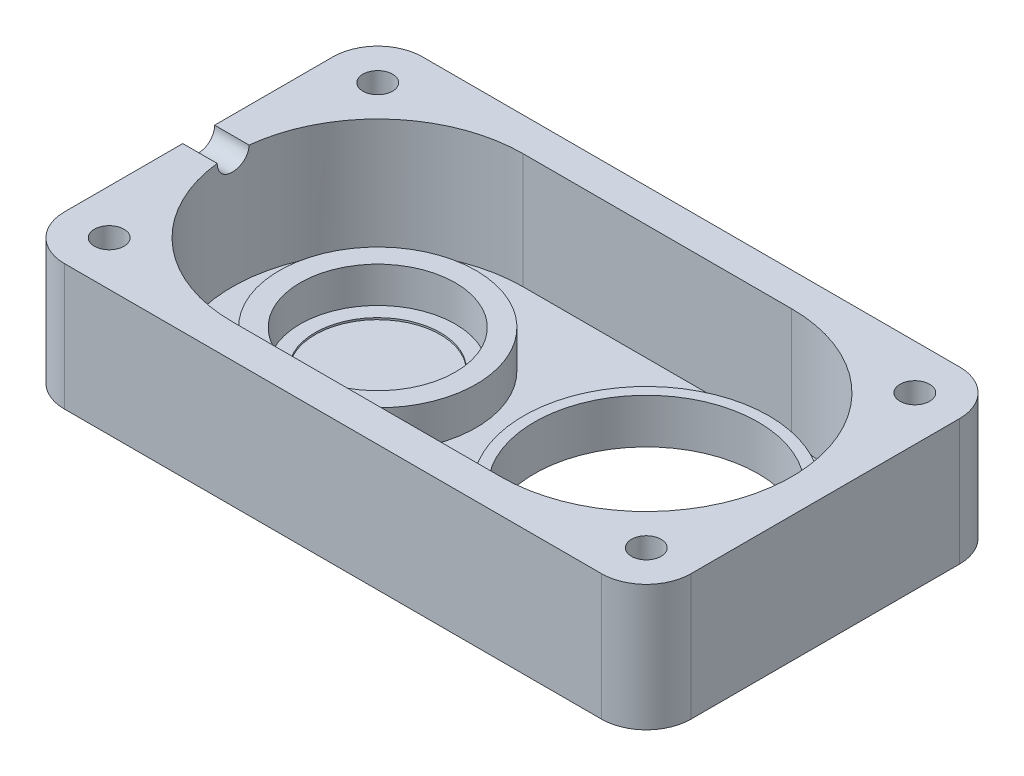
ISO-10303-21;
HEADER;
FILE_DESCRIPTION(('STEP AP214'),'2;1');
FILE_NAME('part.step','',(''),(''),'','','');
FILE_SCHEMA(('AUTOMOTIVE_DESIGN { 1 0 10303 214 1 1 1 1 }'));
ENDSEC;
DATA;
#1=APPLICATION_CONTEXT('core data for automotive mechanical design processes');
#2=APPLICATION_PROTOCOL_DEFINITION('international standard','automotive_design',2000,#1);
#3=PRODUCT_CONTEXT('',#1,'mechanical');
#4=PRODUCT('Part','Part','',(#3));
#5=PRODUCT_RELATED_PRODUCT_CATEGORY('part','',(#4));
#6=PRODUCT_DEFINITION_FORMATION('','',#4);
#7=PRODUCT_DEFINITION_CONTEXT('part definition',#1,'design');
#8=PRODUCT_DEFINITION('design','',#6,#7);
#9=PRODUCT_DEFINITION_SHAPE('','',#8);
#10=(LENGTH_UNIT() NAMED_UNIT(*) SI_UNIT(.MILLI.,.METRE.));
#11=(NAMED_UNIT(*) PLANE_ANGLE_UNIT() SI_UNIT($,.RADIAN.));
#12=(NAMED_UNIT(*) SI_UNIT($,.STERADIAN.) SOLID_ANGLE_UNIT());
#13=UNCERTAINTY_MEASURE_WITH_UNIT(LENGTH_MEASURE(1.E-05),#10,'distance_accuracy_value','');
#14=(GEOMETRIC_REPRESENTATION_CONTEXT(3) GLOBAL_UNCERTAINTY_ASSIGNED_CONTEXT((#13)) GLOBAL_UNIT_ASSIGNED_CONTEXT((#10,
#11,#12)) REPRESENTATION_CONTEXT('',''));
#15=CARTESIAN_POINT('',(0.,0.,0.));
#16=DIRECTION('',(0.,0.,1.));
#17=DIRECTION('',(1.,0.,0.));
#18=AXIS2_PLACEMENT_3D('',#15,#16,#17);
#19=CARTESIAN_POINT('',(-19.05,17.87906,-19.05));
#20=DIRECTION('',(0.,-1.,0.));
#21=DIRECTION('',(0.,0.,-1.));
#22=AXIS2_PLACEMENT_3D('',#19,#20,#21);
#23=CYLINDRICAL_SURFACE('',#22,2.1);
#24=CARTESIAN_POINT('',(-19.05,17.87906,-19.05));
#25=DIRECTION('',(0.,1.,0.));
#26=DIRECTION('',(0.,0.,1.));
#27=AXIS2_PLACEMENT_3D('',#24,#25,#26);
#28=CIRCLE('',#27,2.1);
#29=CARTESIAN_POINT('',(-19.05,17.87906,-16.95));
#30=VERTEX_POINT('',#29);
#31=EDGE_CURVE('E463',#30,#30,#28,.T.);
#32=ORIENTED_EDGE('',*,*,#31,.T.);
#33=EDGE_LOOP('',(#32));
#34=FACE_BOUND('',#33,.T.);
#35=CARTESIAN_POINT('',(-19.05,4.5,-19.05));
#36=DIRECTION('',(0.,-1.,0.));
#37=DIRECTION('',(0.,0.,-1.));
#38=AXIS2_PLACEMENT_3D('',#35,#36,#37);
#39=CIRCLE('',#38,2.1);
#40=CARTESIAN_POINT('',(-19.05,4.5,-21.15));
#41=VERTEX_POINT('',#40);
#42=EDGE_CURVE('E46',#41,#41,#39,.T.);
#43=ORIENTED_EDGE('',*,*,#42,.T.);
#44=EDGE_LOOP('',(#43));
#45=FACE_BOUND('',#44,.T.);
#46=ADVANCED_FACE('F42',(#34,#45),#23,.F.);
#47=CARTESIAN_POINT('',(-19.05,17.87906,19.05));
#48=DIRECTION('',(0.,-1.,0.));
#49=DIRECTION('',(0.,0.,-1.));
#50=AXIS2_PLACEMENT_3D('',#47,#48,#49);
#51=CYLINDRICAL_SURFACE('',#50,2.1);
#52=CARTESIAN_POINT('',(-19.05,17.87906,19.05));
#53=DIRECTION('',(0.,1.,0.));
#54=DIRECTION('',(0.,0.,1.));
#55=AXIS2_PLACEMENT_3D('',#52,#53,#54);
#56=CIRCLE('',#55,2.1);
#57=CARTESIAN_POINT('',(-19.05,17.87906,21.15));
#58=VERTEX_POINT('',#57);
#59=EDGE_CURVE('E459',#58,#58,#56,.T.);
#60=ORIENTED_EDGE('',*,*,#59,.T.);
#61=EDGE_LOOP('',(#60));
#62=FACE_BOUND('',#61,.T.);
#63=CARTESIAN_POINT('',(-19.05,4.5,19.05));
#64=DIRECTION('',(0.,-1.,0.));
#65=DIRECTION('',(0.,0.,-1.));
#66=AXIS2_PLACEMENT_3D('',#63,#64,#65);
#67=CIRCLE('',#66,2.1);
#68=CARTESIAN_POINT('',(-19.05,4.5,16.95));
#69=VERTEX_POINT('',#68);
#70=EDGE_CURVE('E264',#69,#69,#67,.T.);
#71=ORIENTED_EDGE('',*,*,#70,.T.);
#72=EDGE_LOOP('',(#71));
#73=FACE_BOUND('',#72,.T.);
#74=ADVANCED_FACE('F328',(#62,#73),#51,.F.);
#75=CARTESIAN_POINT('',(57.15,17.87906,19.05));
#76=DIRECTION('',(0.,-1.,0.));
#77=DIRECTION('',(0.,0.,-1.));
#78=AXIS2_PLACEMENT_3D('',#75,#76,#77);
#79=CYLINDRICAL_SURFACE('',#78,2.1);
#80=CARTESIAN_POINT('',(57.15,17.87906,19.05));
#81=DIRECTION('',(0.,1.,0.));
#82=DIRECTION('',(0.,0.,1.));
#83=AXIS2_PLACEMENT_3D('',#80,#81,#82);
#84=CIRCLE('',#83,2.1);
#85=CARTESIAN_POINT('',(57.15,17.87906,21.15));
#86=VERTEX_POINT('',#85);
#87=EDGE_CURVE('E455',#86,#86,#84,.T.);
#88=ORIENTED_EDGE('',*,*,#87,.T.);
#89=EDGE_LOOP('',(#88));
#90=FACE_BOUND('',#89,.T.);
#91=CARTESIAN_POINT('',(57.15,4.5,19.05));
#92=DIRECTION('',(0.,-1.,0.));
#93=DIRECTION('',(0.,0.,-1.));
#94=AXIS2_PLACEMENT_3D('',#91,#92,#93);
#95=CIRCLE('',#94,2.1);
#96=CARTESIAN_POINT('',(57.15,4.5,16.95));
#97=VERTEX_POINT('',#96);
#98=EDGE_CURVE('E260',#97,#97,#95,.T.);
#99=ORIENTED_EDGE('',*,*,#98,.T.);
#100=EDGE_LOOP('',(#99));
#101=FACE_BOUND('',#100,.T.);
#102=ADVANCED_FACE('F335',(#90,#101),#79,.F.);
#103=CARTESIAN_POINT('',(57.15,17.87906,-19.05));
#104=DIRECTION('',(0.,-1.,0.));
#105=DIRECTION('',(0.,0.,-1.));
#106=AXIS2_PLACEMENT_3D('',#103,#104,#105);
#107=CYLINDRICAL_SURFACE('',#106,2.1);
#108=CARTESIAN_POINT('',(57.15,17.87906,-19.05));
#109=DIRECTION('',(0.,1.,0.));
#110=DIRECTION('',(0.,0.,1.));
#111=AXIS2_PLACEMENT_3D('',#108,#109,#110);
#112=CIRCLE('',#111,2.1);
#113=CARTESIAN_POINT('',(57.15,17.87906,-16.95));
#114=VERTEX_POINT('',#113);
#115=EDGE_CURVE('E451',#114,#114,#112,.T.);
#116=ORIENTED_EDGE('',*,*,#115,.T.);
#117=EDGE_LOOP('',(#116));
#118=FACE_BOUND('',#117,.T.);
#119=CARTESIAN_POINT('',(57.15,4.5,-19.05));
#120=DIRECTION('',(0.,-1.,0.));
#121=DIRECTION('',(0.,0.,-1.));
#122=AXIS2_PLACEMENT_3D('',#119,#120,#121);
#123=CIRCLE('',#122,2.1);
#124=CARTESIAN_POINT('',(57.15,4.5,-21.15));
#125=VERTEX_POINT('',#124);
#126=EDGE_CURVE('E256',#125,#125,#123,.T.);
#127=ORIENTED_EDGE('',*,*,#126,.T.);
#128=EDGE_LOOP('',(#127));
#129=FACE_BOUND('',#128,.T.);
#130=ADVANCED_FACE('F512',(#118,#129),#107,.F.);
#131=CARTESIAN_POINT('',(-19.05,1.524,-19.05));
#132=DIRECTION('',(0.,-1.,0.));
#133=DIRECTION('',(0.,0.,-1.));
#134=AXIS2_PLACEMENT_3D('',#131,#132,#133);
#135=PLANE('',#134);
#136=CARTESIAN_POINT('',(0.,1.524,0.));
#137=DIRECTION('',(0.,-1.,0.));
#138=DIRECTION('',(0.,0.,-1.));
#139=AXIS2_PLACEMENT_3D('',#136,#137,#138);
#140=CIRCLE('',#139,20.6375);
#141=CARTESIAN_POINT('',(0.,1.524,-20.6375));
#142=VERTEX_POINT('',#141);
#143=CARTESIAN_POINT('',(0.,1.524,20.6375));
#144=VERTEX_POINT('',#143);
#145=EDGE_CURVE('E428',#142,#144,#140,.F.);
#146=ORIENTED_EDGE('',*,*,#145,.T.);
#147=DIRECTION('',(1.,0.,0.));
#148=VECTOR('',#147,1.);
#149=CARTESIAN_POINT('',(38.1,1.524,20.6375));
#150=LINE('',#149,#148);
#151=CARTESIAN_POINT('',(38.1,1.524,20.6375));
#152=VERTEX_POINT('',#151);
#153=EDGE_CURVE('E423',#144,#152,#150,.T.);
#154=ORIENTED_EDGE('',*,*,#153,.T.);
#155=CARTESIAN_POINT('',(38.1,1.524,0.));
#156=DIRECTION('',(0.,-1.,0.));
#157=DIRECTION('',(0.,0.,-1.));
#158=AXIS2_PLACEMENT_3D('',#155,#156,#157);
#159=CIRCLE('',#158,20.6375);
#160=CARTESIAN_POINT('',(38.1,1.524,-20.6375));
#161=VERTEX_POINT('',#160);
#162=EDGE_CURVE('E438',#152,#161,#159,.F.);
#163=ORIENTED_EDGE('',*,*,#162,.T.);
#164=DIRECTION('',(-1.,0.,0.));
#165=VECTOR('',#164,1.);
#166=CARTESIAN_POINT('',(0.,1.524,-20.6375));
#167=LINE('',#166,#165);
#168=EDGE_CURVE('E433',#161,#142,#167,.T.);
#169=ORIENTED_EDGE('',*,*,#168,.T.);
#170=EDGE_LOOP('',(#146,#154,#163,#169));
#171=FACE_BOUND('',#170,.T.);
#172=CARTESIAN_POINT('',(0.,1.524,0.));
#173=DIRECTION('',(0.,-1.,0.));
#174=DIRECTION('',(0.,0.,-1.));
#175=AXIS2_PLACEMENT_3D('',#172,#173,#174);
#176=CIRCLE('',#175,13.97);
#177=CARTESIAN_POINT('',(0.,1.524,-13.97));
#178=VERTEX_POINT('',#177);
#179=EDGE_CURVE('E52',#178,#178,#176,.F.);
#180=ORIENTED_EDGE('',*,*,#179,.F.);
#181=EDGE_LOOP('',(#180));
#182=FACE_BOUND('',#181,.T.);
#183=CARTESIAN_POINT('',(38.1,1.524,0.));
#184=DIRECTION('',(0.,-1.,0.));
#185=DIRECTION('',(0.,0.,-1.));
#186=AXIS2_PLACEMENT_3D('',#183,#184,#185);
#187=CIRCLE('',#186,17.399);
#188=CARTESIAN_POINT('',(38.1,1.524,-17.399));
#189=VERTEX_POINT('',#188);
#190=EDGE_CURVE('E12',#189,#189,#187,.F.);
#191=ORIENTED_EDGE('',*,*,#190,.F.);
#192=EDGE_LOOP('',(#191));
#193=FACE_BOUND('',#192,.T.);
#194=ADVANCED_FACE('F350',(#171,#182,#193),#135,.F.);
#195=CARTESIAN_POINT('',(-19.05,17.87906,-19.05));
#196=DIRECTION('',(0.,-1.,0.));
#197=DIRECTION('',(0.,0.,-1.));
#198=AXIS2_PLACEMENT_3D('',#195,#196,#197);
#199=PLANE('',#198);
#200=CARTESIAN_POINT('',(0.,17.87906,0.));
#201=DIRECTION('',(0.,1.,0.));
#202=DIRECTION('',(0.,0.,1.));
#203=AXIS2_PLACEMENT_3D('',#200,#201,#202);
#204=CIRCLE('',#203,20.6375);
#205=CARTESIAN_POINT('',(-20.5133150390179,17.87906,2.2606));
#206=VERTEX_POINT('',#205);
#207=CARTESIAN_POINT('',(0.,17.87906,20.6375));
#208=VERTEX_POINT('',#207);
#209=EDGE_CURVE('E162',#206,#208,#204,.T.);
#210=ORIENTED_EDGE('',*,*,#209,.F.);
#211=DIRECTION('',(-1.,0.,0.));
#212=VECTOR('',#211,1.);
#213=CARTESIAN_POINT('',(63.501,17.87906,2.2606));
#214=LINE('',#213,#212);
#215=CARTESIAN_POINT('',(-25.4,17.87906,2.2606));
#216=VERTEX_POINT('',#215);
#217=EDGE_CURVE('E60',#216,#206,#214,.F.);
#218=ORIENTED_EDGE('',*,*,#217,.F.);
#219=DIRECTION('',(0.,0.,1.));
#220=VECTOR('',#219,1.);
#221=CARTESIAN_POINT('',(-25.4,17.87906,19.05));
#222=LINE('',#221,#220);
#223=CARTESIAN_POINT('',(-25.4,17.87906,19.05));
#224=VERTEX_POINT('',#223);
#225=EDGE_CURVE('E159',#216,#224,#222,.T.);
#226=ORIENTED_EDGE('',*,*,#225,.T.);
#227=CARTESIAN_POINT('',(-19.05,17.87906,19.05));
#228=DIRECTION('',(0.,1.,0.));
#229=DIRECTION('',(0.,0.,-1.));
#230=AXIS2_PLACEMENT_3D('',#227,#228,#229);
#231=CIRCLE('',#230,6.35);
#232=CARTESIAN_POINT('',(-19.0499999999999,17.87906,25.4));
#233=VERTEX_POINT('',#232);
#234=EDGE_CURVE('E175',#224,#233,#231,.T.);
#235=ORIENTED_EDGE('',*,*,#234,.T.);
#236=DIRECTION('',(1.,0.,0.));
#237=VECTOR('',#236,1.);
#238=CARTESIAN_POINT('',(-19.0499999999999,17.87906,25.4));
#239=LINE('',#238,#237);
#240=CARTESIAN_POINT('',(57.15,17.87906,25.4));
#241=VERTEX_POINT('',#240);
#242=EDGE_CURVE('E183',#233,#241,#239,.T.);
#243=ORIENTED_EDGE('',*,*,#242,.T.);
#244=CARTESIAN_POINT('',(57.15,17.87906,19.05));
#245=DIRECTION('',(0.,1.,0.));
#246=DIRECTION('',(0.,0.,1.));
#247=AXIS2_PLACEMENT_3D('',#244,#245,#246);
#248=CIRCLE('',#247,6.35);
#249=CARTESIAN_POINT('',(63.5,17.87906,19.05));
#250=VERTEX_POINT('',#249);
#251=EDGE_CURVE('E186',#241,#250,#248,.T.);
#252=ORIENTED_EDGE('',*,*,#251,.T.);
#253=DIRECTION('',(0.,0.,-1.));
#254=VECTOR('',#253,1.);
#255=CARTESIAN_POINT('',(63.5,17.87906,19.05));
#256=LINE('',#255,#254);
#257=CARTESIAN_POINT('',(63.5,17.87906,-19.05));
#258=VERTEX_POINT('',#257);
#259=EDGE_CURVE('E189',#250,#258,#256,.T.);
#260=ORIENTED_EDGE('',*,*,#259,.T.);
#261=CARTESIAN_POINT('',(57.15,17.87906,-19.05));
#262=DIRECTION('',(0.,1.,0.));
#263=DIRECTION('',(0.,0.,-1.));
#264=AXIS2_PLACEMENT_3D('',#261,#262,#263);
#265=CIRCLE('',#264,6.35);
#266=CARTESIAN_POINT('',(57.15,17.87906,-25.4));
#267=VERTEX_POINT('',#266);
#268=EDGE_CURVE('E192',#258,#267,#265,.T.);
#269=ORIENTED_EDGE('',*,*,#268,.T.);
#270=DIRECTION('',(-1.,0.,0.));
#271=VECTOR('',#270,1.);
#272=CARTESIAN_POINT('',(-19.0499999999999,17.87906,-25.4));
#273=LINE('',#272,#271);
#274=CARTESIAN_POINT('',(-19.0499999999999,17.87906,-25.4));
#275=VERTEX_POINT('',#274);
#276=EDGE_CURVE('E195',#267,#275,#273,.T.);
#277=ORIENTED_EDGE('',*,*,#276,.T.);
#278=CARTESIAN_POINT('',(-19.05,17.87906,-19.05));
#279=DIRECTION('',(0.,1.,0.));
#280=DIRECTION('',(0.,0.,-1.));
#281=AXIS2_PLACEMENT_3D('',#278,#279,#280);
#282=CIRCLE('',#281,6.35);
#283=CARTESIAN_POINT('',(-25.4,17.87906,-19.05));
#284=VERTEX_POINT('',#283);
#285=EDGE_CURVE('E171',#275,#284,#282,.T.);
#286=ORIENTED_EDGE('',*,*,#285,.T.);
#287=CARTESIAN_POINT('',(-25.4,17.87906,-2.2606));
#288=VERTEX_POINT('',#287);
#289=EDGE_CURVE('E170',#284,#288,#222,.T.);
#290=ORIENTED_EDGE('',*,*,#289,.T.);
#291=DIRECTION('',(-1.,0.,0.));
#292=VECTOR('',#291,1.);
#293=CARTESIAN_POINT('',(63.501,17.87906,-2.2606));
#294=LINE('',#293,#292);
#295=CARTESIAN_POINT('',(-20.5133150390179,17.87906,-2.2606));
#296=VERTEX_POINT('',#295);
#297=EDGE_CURVE('E148',#296,#288,#294,.T.);
#298=ORIENTED_EDGE('',*,*,#297,.F.);
#299=CARTESIAN_POINT('',(0.,17.87906,-20.6375));
#300=VERTEX_POINT('',#299);
#301=EDGE_CURVE('E408',#300,#296,#204,.T.);
#302=ORIENTED_EDGE('',*,*,#301,.F.);
#303=DIRECTION('',(-1.,0.,0.));
#304=VECTOR('',#303,1.);
#305=CARTESIAN_POINT('',(0.,17.87906,-20.6375));
#306=LINE('',#305,#304);
#307=CARTESIAN_POINT('',(38.1,17.87906,-20.6375));
#308=VERTEX_POINT('',#307);
#309=EDGE_CURVE('E68',#308,#300,#306,.T.);
#310=ORIENTED_EDGE('',*,*,#309,.F.);
#311=CARTESIAN_POINT('',(38.1,17.87906,0.));
#312=DIRECTION('',(0.,1.,0.));
#313=DIRECTION('',(0.,0.,1.));
#314=AXIS2_PLACEMENT_3D('',#311,#312,#313);
#315=CIRCLE('',#314,20.6375);
#316=CARTESIAN_POINT('',(38.1,17.87906,20.6375));
#317=VERTEX_POINT('',#316);
#318=EDGE_CURVE('E418',#317,#308,#315,.T.);
#319=ORIENTED_EDGE('',*,*,#318,.F.);
#320=DIRECTION('',(1.,0.,0.));
#321=VECTOR('',#320,1.);
#322=CARTESIAN_POINT('',(38.1,17.87906,20.6375));
#323=LINE('',#322,#321);
#324=EDGE_CURVE('E413',#208,#317,#323,.T.);
#325=ORIENTED_EDGE('',*,*,#324,.F.);
#326=EDGE_LOOP('',(#210,#218,#226,#235,#243,#252,#260,#269,#277,#286,#290,#298,#302,#310,#319,#325));
#327=FACE_BOUND('',#326,.T.);
#328=ORIENTED_EDGE('',*,*,#31,.F.);
#329=EDGE_LOOP('',(#328));
#330=FACE_BOUND('',#329,.T.);
#331=ORIENTED_EDGE('',*,*,#59,.F.);
#332=EDGE_LOOP('',(#331));
#333=FACE_BOUND('',#332,.T.);
#334=ORIENTED_EDGE('',*,*,#87,.F.);
#335=EDGE_LOOP('',(#334));
#336=FACE_BOUND('',#335,.T.);
#337=ORIENTED_EDGE('',*,*,#115,.F.);
#338=EDGE_LOOP('',(#337));
#339=FACE_BOUND('',#338,.T.);
#340=ADVANCED_FACE('F157',(#327,#330,#333,#336,#339),#199,.F.);
#341=CARTESIAN_POINT('',(-19.05,0.,-19.05));
#342=DIRECTION('',(0.,-1.,0.));
#343=DIRECTION('',(0.,0.,-1.));
#344=AXIS2_PLACEMENT_3D('',#341,#342,#343);
#345=PLANE('',#344);
#346=CARTESIAN_POINT('',(57.15,0.,19.05));
#347=DIRECTION('',(0.,-1.,0.));
#348=DIRECTION('',(0.,0.,-1.));
#349=AXIS2_PLACEMENT_3D('',#346,#347,#348);
#350=CIRCLE('',#349,3.75000000000001);
#351=CARTESIAN_POINT('',(57.15,0.,15.3));
#352=VERTEX_POINT('',#351);
#353=EDGE_CURVE('E572',#352,#352,#350,.T.);
#354=ORIENTED_EDGE('',*,*,#353,.F.);
#355=EDGE_LOOP('',(#354));
#356=FACE_BOUND('',#355,.T.);
#357=CARTESIAN_POINT('',(57.15,0.,-19.05));
#358=DIRECTION('',(0.,-1.,0.));
#359=DIRECTION('',(0.,0.,-1.));
#360=AXIS2_PLACEMENT_3D('',#357,#358,#359);
#361=CIRCLE('',#360,3.75000000000001);
#362=CARTESIAN_POINT('',(57.15,0.,-22.8));
#363=VERTEX_POINT('',#362);
#364=EDGE_CURVE('E571',#363,#363,#361,.T.);
#365=ORIENTED_EDGE('',*,*,#364,.F.);
#366=EDGE_LOOP('',(#365));
#367=FACE_BOUND('',#366,.T.);
#368=CARTESIAN_POINT('',(-19.05,0.,-19.05));
#369=DIRECTION('',(0.,-1.,0.));
#370=DIRECTION('',(0.,0.,-1.));
#371=AXIS2_PLACEMENT_3D('',#368,#369,#370);
#372=CIRCLE('',#371,3.75);
#373=CARTESIAN_POINT('',(-19.05,0.,-22.8));
#374=VERTEX_POINT('',#373);
#375=EDGE_CURVE('E593',#374,#374,#372,.T.);
#376=ORIENTED_EDGE('',*,*,#375,.F.);
#377=EDGE_LOOP('',(#376));
#378=FACE_BOUND('',#377,.T.);
#379=CARTESIAN_POINT('',(-19.05,0.,19.05));
#380=DIRECTION('',(0.,-1.,0.));
#381=DIRECTION('',(0.,0.,-1.));
#382=AXIS2_PLACEMENT_3D('',#379,#380,#381);
#383=CIRCLE('',#382,3.75);
#384=CARTESIAN_POINT('',(-19.05,0.,15.3));
#385=VERTEX_POINT('',#384);
#386=EDGE_CURVE('E276',#385,#385,#383,.T.);
#387=ORIENTED_EDGE('',*,*,#386,.F.);
#388=EDGE_LOOP('',(#387));
#389=FACE_BOUND('',#388,.T.);
#390=CARTESIAN_POINT('',(-19.05,0.,-19.05));
#391=DIRECTION('',(0.,1.,0.));
#392=DIRECTION('',(0.,0.,-1.));
#393=AXIS2_PLACEMENT_3D('',#390,#391,#392);
#394=CIRCLE('',#393,6.35);
#395=CARTESIAN_POINT('',(-19.0499999999999,0.,-25.4));
#396=VERTEX_POINT('',#395);
#397=CARTESIAN_POINT('',(-25.4,0.,-19.05));
#398=VERTEX_POINT('',#397);
#399=EDGE_CURVE('E199',#396,#398,#394,.T.);
#400=ORIENTED_EDGE('',*,*,#399,.F.);
#401=DIRECTION('',(-1.,0.,0.));
#402=VECTOR('',#401,1.);
#403=CARTESIAN_POINT('',(-19.0499999999999,0.,-25.4));
#404=LINE('',#403,#402);
#405=CARTESIAN_POINT('',(57.15,0.,-25.4));
#406=VERTEX_POINT('',#405);
#407=EDGE_CURVE('E177',#406,#396,#404,.T.);
#408=ORIENTED_EDGE('',*,*,#407,.F.);
#409=CARTESIAN_POINT('',(57.15,0.,-19.05));
#410=DIRECTION('',(0.,1.,0.));
#411=DIRECTION('',(0.,0.,-1.));
#412=AXIS2_PLACEMENT_3D('',#409,#410,#411);
#413=CIRCLE('',#412,6.35);
#414=CARTESIAN_POINT('',(63.5,0.,-19.05));
#415=VERTEX_POINT('',#414);
#416=EDGE_CURVE('E219',#415,#406,#413,.T.);
#417=ORIENTED_EDGE('',*,*,#416,.F.);
#418=DIRECTION('',(0.,0.,-1.));
#419=VECTOR('',#418,1.);
#420=CARTESIAN_POINT('',(63.5,0.,19.05));
#421=LINE('',#420,#419);
#422=CARTESIAN_POINT('',(63.5,0.,19.05));
#423=VERTEX_POINT('',#422);
#424=EDGE_CURVE('E216',#423,#415,#421,.T.);
#425=ORIENTED_EDGE('',*,*,#424,.F.);
#426=CARTESIAN_POINT('',(57.15,0.,19.05));
#427=DIRECTION('',(0.,1.,0.));
#428=DIRECTION('',(0.,0.,1.));
#429=AXIS2_PLACEMENT_3D('',#426,#427,#428);
#430=CIRCLE('',#429,6.35);
#431=CARTESIAN_POINT('',(57.15,0.,25.4));
#432=VERTEX_POINT('',#431);
#433=EDGE_CURVE('E213',#432,#423,#430,.T.);
#434=ORIENTED_EDGE('',*,*,#433,.F.);
#435=DIRECTION('',(1.,0.,0.));
#436=VECTOR('',#435,1.);
#437=CARTESIAN_POINT('',(-19.0499999999999,0.,25.4));
#438=LINE('',#437,#436);
#439=CARTESIAN_POINT('',(-19.0499999999999,0.,25.4));
#440=VERTEX_POINT('',#439);
#441=EDGE_CURVE('E210',#440,#432,#438,.T.);
#442=ORIENTED_EDGE('',*,*,#441,.F.);
#443=CARTESIAN_POINT('',(-19.05,0.,19.05));
#444=DIRECTION('',(0.,1.,0.));
#445=DIRECTION('',(0.,0.,-1.));
#446=AXIS2_PLACEMENT_3D('',#443,#444,#445);
#447=CIRCLE('',#446,6.35);
#448=CARTESIAN_POINT('',(-25.4,0.,19.05));
#449=VERTEX_POINT('',#448);
#450=EDGE_CURVE('E207',#449,#440,#447,.T.);
#451=ORIENTED_EDGE('',*,*,#450,.F.);
#452=DIRECTION('',(0.,0.,1.));
#453=VECTOR('',#452,1.);
#454=CARTESIAN_POINT('',(-25.4,0.,19.05));
#455=LINE('',#454,#453);
#456=EDGE_CURVE('E203',#398,#449,#455,.T.);
#457=ORIENTED_EDGE('',*,*,#456,.F.);
#458=EDGE_LOOP('',(#400,#408,#417,#425,#434,#442,#451,#457));
#459=FACE_BOUND('',#458,.T.);
#460=CARTESIAN_POINT('',(38.1,0.,0.));
#461=DIRECTION('',(0.,1.,0.));
#462=DIRECTION('',(0.,0.,1.));
#463=AXIS2_PLACEMENT_3D('',#460,#461,#462);
#464=CIRCLE('',#463,15.875);
#465=CARTESIAN_POINT('',(38.1,0.,15.875));
#466=VERTEX_POINT('',#465);
#467=EDGE_CURVE('E204',#466,#466,#464,.T.);
#468=ORIENTED_EDGE('',*,*,#467,.T.);
#469=EDGE_LOOP('',(#468));
#470=FACE_BOUND('',#469,.T.);
#471=ADVANCED_FACE('F349',(#356,#367,#378,#389,#459,#470),#345,.T.);
#472=CARTESIAN_POINT('',(-19.05,17.87906,-19.05));
#473=DIRECTION('',(0.,-1.,0.));
#474=DIRECTION('',(0.,0.,-1.));
#475=AXIS2_PLACEMENT_3D('',#472,#473,#474);
#476=CYLINDRICAL_SURFACE('',#475,6.35);
#477=ORIENTED_EDGE('',*,*,#399,.T.);
#478=DIRECTION('',(0.,-1.,0.));
#479=VECTOR('',#478,1.);
#480=CARTESIAN_POINT('',(-25.4,17.87906,-19.05));
#481=LINE('',#480,#479);
#482=EDGE_CURVE('E249',#284,#398,#481,.T.);
#483=ORIENTED_EDGE('',*,*,#482,.F.);
#484=ORIENTED_EDGE('',*,*,#285,.F.);
#485=DIRECTION('',(0.,-1.,0.));
#486=VECTOR('',#485,1.);
#487=CARTESIAN_POINT('',(-19.0499999999999,17.87906,-25.4));
#488=LINE('',#487,#486);
#489=EDGE_CURVE('E198',#275,#396,#488,.T.);
#490=ORIENTED_EDGE('',*,*,#489,.T.);
#491=EDGE_LOOP('',(#477,#483,#484,#490));
#492=FACE_BOUND('',#491,.T.);
#493=ADVANCED_FACE('F44',(#492),#476,.T.);
#494=CARTESIAN_POINT('',(-25.4,17.87906,19.05));
#495=DIRECTION('',(1.,0.,0.));
#496=DIRECTION('',(0.,0.,-1.));
#497=AXIS2_PLACEMENT_3D('',#494,#495,#496);
#498=PLANE('',#497);
#499=ORIENTED_EDGE('',*,*,#225,.F.);
#500=CARTESIAN_POINT('',(-25.4,17.87906,0.));
#501=DIRECTION('',(-1.,0.,0.));
#502=DIRECTION('',(0.,0.,1.));
#503=AXIS2_PLACEMENT_3D('',#500,#501,#502);
#504=CIRCLE('',#503,2.2606);
#505=EDGE_CURVE('E145',#288,#216,#504,.T.);
#506=ORIENTED_EDGE('',*,*,#505,.F.);
#507=ORIENTED_EDGE('',*,*,#289,.F.);
#508=ORIENTED_EDGE('',*,*,#482,.T.);
#509=ORIENTED_EDGE('',*,*,#456,.T.);
#510=DIRECTION('',(0.,-1.,0.));
#511=VECTOR('',#510,1.);
#512=CARTESIAN_POINT('',(-25.4,17.87906,19.05));
#513=LINE('',#512,#511);
#514=EDGE_CURVE('E167',#224,#449,#513,.T.);
#515=ORIENTED_EDGE('',*,*,#514,.F.);
#516=EDGE_LOOP('',(#499,#506,#507,#508,#509,#515));
#517=FACE_BOUND('',#516,.T.);
#518=ADVANCED_FACE('F165',(#517),#498,.F.);
#519=CARTESIAN_POINT('',(-19.05,17.87906,19.05));
#520=DIRECTION('',(0.,-1.,0.));
#521=DIRECTION('',(0.,0.,-1.));
#522=AXIS2_PLACEMENT_3D('',#519,#520,#521);
#523=CYLINDRICAL_SURFACE('',#522,6.35);
#524=ORIENTED_EDGE('',*,*,#450,.T.);
#525=DIRECTION('',(0.,-1.,0.));
#526=VECTOR('',#525,1.);
#527=CARTESIAN_POINT('',(-19.0499999999999,17.87906,25.4));
#528=LINE('',#527,#526);
#529=EDGE_CURVE('E243',#233,#440,#528,.T.);
#530=ORIENTED_EDGE('',*,*,#529,.F.);
#531=ORIENTED_EDGE('',*,*,#234,.F.);
#532=ORIENTED_EDGE('',*,*,#514,.T.);
#533=EDGE_LOOP('',(#524,#530,#531,#532));
#534=FACE_BOUND('',#533,.T.);
#535=ADVANCED_FACE('F372',(#534),#523,.T.);
#536=CARTESIAN_POINT('',(-19.0499999999999,17.87906,25.4));
#537=DIRECTION('',(0.,0.,-1.));
#538=DIRECTION('',(-1.,0.,0.));
#539=AXIS2_PLACEMENT_3D('',#536,#537,#538);
#540=PLANE('',#539);
#541=ORIENTED_EDGE('',*,*,#441,.T.);
#542=DIRECTION('',(0.,-1.,0.));
#543=VECTOR('',#542,1.);
#544=CARTESIAN_POINT('',(57.15,17.87906,25.4));
#545=LINE('',#544,#543);
#546=EDGE_CURVE('E239',#241,#432,#545,.T.);
#547=ORIENTED_EDGE('',*,*,#546,.F.);
#548=ORIENTED_EDGE('',*,*,#242,.F.);
#549=ORIENTED_EDGE('',*,*,#529,.T.);
#550=EDGE_LOOP('',(#541,#547,#548,#549));
#551=FACE_BOUND('',#550,.T.);
#552=ADVANCED_FACE('F368',(#551),#540,.F.);
#553=CARTESIAN_POINT('',(57.15,17.87906,19.05));
#554=DIRECTION('',(0.,-1.,0.));
#555=DIRECTION('',(0.,0.,-1.));
#556=AXIS2_PLACEMENT_3D('',#553,#554,#555);
#557=CYLINDRICAL_SURFACE('',#556,6.35);
#558=ORIENTED_EDGE('',*,*,#433,.T.);
#559=DIRECTION('',(0.,-1.,0.));
#560=VECTOR('',#559,1.);
#561=CARTESIAN_POINT('',(63.5,17.87906,19.05));
#562=LINE('',#561,#560);
#563=EDGE_CURVE('E235',#250,#423,#562,.T.);
#564=ORIENTED_EDGE('',*,*,#563,.F.);
#565=ORIENTED_EDGE('',*,*,#251,.F.);
#566=ORIENTED_EDGE('',*,*,#546,.T.);
#567=EDGE_LOOP('',(#558,#564,#565,#566));
#568=FACE_BOUND('',#567,.T.);
#569=ADVANCED_FACE('F364',(#568),#557,.T.);
#570=CARTESIAN_POINT('',(63.5,17.87906,19.05));
#571=DIRECTION('',(-1.,0.,0.));
#572=DIRECTION('',(0.,0.,1.));
#573=AXIS2_PLACEMENT_3D('',#570,#571,#572);
#574=PLANE('',#573);
#575=ORIENTED_EDGE('',*,*,#424,.T.);
#576=DIRECTION('',(0.,-1.,0.));
#577=VECTOR('',#576,1.);
#578=CARTESIAN_POINT('',(63.5,17.87906,-19.05));
#579=LINE('',#578,#577);
#580=EDGE_CURVE('E231',#258,#415,#579,.T.);
#581=ORIENTED_EDGE('',*,*,#580,.F.);
#582=ORIENTED_EDGE('',*,*,#259,.F.);
#583=ORIENTED_EDGE('',*,*,#563,.T.);
#584=EDGE_LOOP('',(#575,#581,#582,#583));
#585=FACE_BOUND('',#584,.T.);
#586=ADVANCED_FACE('F360',(#585),#574,.F.);
#587=CARTESIAN_POINT('',(57.15,17.87906,-19.05));
#588=DIRECTION('',(0.,-1.,0.));
#589=DIRECTION('',(0.,0.,-1.));
#590=AXIS2_PLACEMENT_3D('',#587,#588,#589);
#591=CYLINDRICAL_SURFACE('',#590,6.35);
#592=ORIENTED_EDGE('',*,*,#416,.T.);
#593=DIRECTION('',(0.,-1.,0.));
#594=VECTOR('',#593,1.);
#595=CARTESIAN_POINT('',(57.15,17.87906,-25.4));
#596=LINE('',#595,#594);
#597=EDGE_CURVE('E227',#267,#406,#596,.T.);
#598=ORIENTED_EDGE('',*,*,#597,.F.);
#599=ORIENTED_EDGE('',*,*,#268,.F.);
#600=ORIENTED_EDGE('',*,*,#580,.T.);
#601=EDGE_LOOP('',(#592,#598,#599,#600));
#602=FACE_BOUND('',#601,.T.);
#603=ADVANCED_FACE('F356',(#602),#591,.T.);
#604=CARTESIAN_POINT('',(-19.0499999999999,17.87906,-25.4));
#605=DIRECTION('',(0.,0.,1.));
#606=DIRECTION('',(1.,0.,0.));
#607=AXIS2_PLACEMENT_3D('',#604,#605,#606);
#608=PLANE('',#607);
#609=ORIENTED_EDGE('',*,*,#407,.T.);
#610=ORIENTED_EDGE('',*,*,#489,.F.);
#611=ORIENTED_EDGE('',*,*,#276,.F.);
#612=ORIENTED_EDGE('',*,*,#597,.T.);
#613=EDGE_LOOP('',(#609,#610,#611,#612));
#614=FACE_BOUND('',#613,.T.);
#615=ADVANCED_FACE('F345',(#614),#608,.F.);
#616=CARTESIAN_POINT('',(38.1,17.87906,0.));
#617=DIRECTION('',(0.,-1.,0.));
#618=DIRECTION('',(0.,0.,-1.));
#619=AXIS2_PLACEMENT_3D('',#616,#617,#618);
#620=CYLINDRICAL_SURFACE('',#619,15.875);
#621=ORIENTED_EDGE('',*,*,#467,.F.);
#622=EDGE_LOOP('',(#621));
#623=FACE_BOUND('',#622,.T.);
#624=CARTESIAN_POINT('',(38.1,6.35,0.));
#625=DIRECTION('',(0.,1.,0.));
#626=DIRECTION('',(0.,0.,1.));
#627=AXIS2_PLACEMENT_3D('',#624,#625,#626);
#628=CIRCLE('',#627,15.875);
#629=CARTESIAN_POINT('',(38.1,6.35,15.875));
#630=VERTEX_POINT('',#629);
#631=EDGE_CURVE('E287',#630,#630,#628,.T.);
#632=ORIENTED_EDGE('',*,*,#631,.T.);
#633=EDGE_LOOP('',(#632));
#634=FACE_BOUND('',#633,.T.);
#635=ADVANCED_FACE('F341',(#623,#634),#620,.F.);
#636=CARTESIAN_POINT('',(38.1,-89.4651678028941,20.6375));
#637=DIRECTION('',(0.,0.,1.));
#638=DIRECTION('',(1.,0.,0.));
#639=AXIS2_PLACEMENT_3D('',#636,#637,#638);
#640=PLANE('',#639);
#641=DIRECTION('',(0.,1.,0.));
#642=VECTOR('',#641,1.);
#643=CARTESIAN_POINT('',(0.,-89.4651678028941,20.6375));
#644=LINE('',#643,#642);
#645=EDGE_CURVE('E432',#144,#208,#644,.T.);
#646=ORIENTED_EDGE('',*,*,#645,.T.);
#647=ORIENTED_EDGE('',*,*,#324,.T.);
#648=DIRECTION('',(0.,1.,0.));
#649=VECTOR('',#648,1.);
#650=CARTESIAN_POINT('',(38.1,-89.4651678028941,20.6375));
#651=LINE('',#650,#649);
#652=EDGE_CURVE('E427',#152,#317,#651,.T.);
#653=ORIENTED_EDGE('',*,*,#652,.F.);
#654=ORIENTED_EDGE('',*,*,#153,.F.);
#655=EDGE_LOOP('',(#646,#647,#653,#654));
#656=FACE_BOUND('',#655,.T.);
#657=ADVANCED_FACE('F344',(#656),#640,.F.);
#658=CARTESIAN_POINT('',(38.1,-89.4651678028941,0.));
#659=DIRECTION('',(0.,1.,0.));
#660=DIRECTION('',(0.,0.,1.));
#661=AXIS2_PLACEMENT_3D('',#658,#659,#660);
#662=CYLINDRICAL_SURFACE('',#661,20.6375);
#663=ORIENTED_EDGE('',*,*,#652,.T.);
#664=ORIENTED_EDGE('',*,*,#318,.T.);
#665=DIRECTION('',(0.,1.,0.));
#666=VECTOR('',#665,1.);
#667=CARTESIAN_POINT('',(38.1,-89.4651678028941,-20.6375));
#668=LINE('',#667,#666);
#669=EDGE_CURVE('E437',#161,#308,#668,.T.);
#670=ORIENTED_EDGE('',*,*,#669,.F.);
#671=ORIENTED_EDGE('',*,*,#162,.F.);
#672=EDGE_LOOP('',(#663,#664,#670,#671));
#673=FACE_BOUND('',#672,.T.);
#674=ADVANCED_FACE('F504',(#673),#662,.F.);
#675=CARTESIAN_POINT('',(0.,-89.4651678028941,-20.6375));
#676=DIRECTION('',(0.,0.,-1.));
#677=DIRECTION('',(-1.,0.,0.));
#678=AXIS2_PLACEMENT_3D('',#675,#676,#677);
#679=PLANE('',#678);
#680=ORIENTED_EDGE('',*,*,#669,.T.);
#681=ORIENTED_EDGE('',*,*,#309,.T.);
#682=DIRECTION('',(0.,1.,0.));
#683=VECTOR('',#682,1.);
#684=CARTESIAN_POINT('',(0.,-89.4651678028941,-20.6375));
#685=LINE('',#684,#683);
#686=EDGE_CURVE('E411',#142,#300,#685,.T.);
#687=ORIENTED_EDGE('',*,*,#686,.F.);
#688=ORIENTED_EDGE('',*,*,#168,.F.);
#689=EDGE_LOOP('',(#680,#681,#687,#688));
#690=FACE_BOUND('',#689,.T.);
#691=ADVANCED_FACE('F509',(#690),#679,.F.);
#692=CARTESIAN_POINT('',(0.,-89.4651678028941,0.));
#693=DIRECTION('',(0.,1.,0.));
#694=DIRECTION('',(0.,0.,1.));
#695=AXIS2_PLACEMENT_3D('',#692,#693,#694);
#696=CYLINDRICAL_SURFACE('',#695,20.6375);
#697=ORIENTED_EDGE('',*,*,#301,.T.);
#698=CARTESIAN_POINT('',(-20.5133150390179,17.87906,2.2606));
#699=CARTESIAN_POINT('',(-20.5133133556632,17.8156631387057,2.26059980503546));
#700=CARTESIAN_POINT('',(-20.5136093077599,17.7522968365279,2.2579314443997));
#701=CARTESIAN_POINT('',(-20.5147787296323,17.6260214015537,2.24728775793643));
#702=CARTESIAN_POINT('',(-20.5156521588689,17.5631122369795,2.23931280463244));
#703=CARTESIAN_POINT('',(-20.5191078541389,17.3758811218725,2.2075106112396));
#704=CARTESIAN_POINT('',(-20.5225256558794,17.2528192765671,2.1758057863602));
#705=CARTESIAN_POINT('',(-20.5312064777216,17.0138093315883,2.09229717476792));
#706=CARTESIAN_POINT('',(-20.5364701602616,16.8978638033505,2.04048617176168));
#707=CARTESIAN_POINT('',(-20.548247271117,16.6763077413806,1.9182533481805));
#708=CARTESIAN_POINT('',(-20.5547605677142,16.5706961201506,1.84783348881753));
#709=CARTESIAN_POINT('',(-20.5683338745023,16.3723712603185,1.69006538494799));
#710=CARTESIAN_POINT('',(-20.5753958510482,16.2797080896082,1.60265439321453));
#711=CARTESIAN_POINT('',(-20.5892538787185,16.1103246461565,1.41350833790193));
#712=CARTESIAN_POINT('',(-20.5960498892128,16.0336068016397,1.31177109660996));
#713=CARTESIAN_POINT('',(-20.6086294797776,15.8981276379847,1.09655261120719));
#714=CARTESIAN_POINT('',(-20.6144104835715,15.839411737418,0.983042613682982));
#715=CARTESIAN_POINT('',(-20.6242865266278,15.7418966159125,0.747706908504516));
#716=CARTESIAN_POINT('',(-20.6283817154425,15.7030956282055,0.625881939606769));
#717=CARTESIAN_POINT('',(-20.6344111260582,15.6466576140165,0.377887072948627));
#718=CARTESIAN_POINT('',(-20.6363539564997,15.6289362556516,0.251736579854267));
#719=CARTESIAN_POINT('',(-20.6378890919841,15.614899342011,-0.00176503182827857));
#720=CARTESIAN_POINT('',(-20.6374814119663,15.6185836506861,-0.129116142780487));
#721=CARTESIAN_POINT('',(-20.6343683910854,15.647186112055,-0.380824123300031));
#722=CARTESIAN_POINT('',(-20.6316729291923,15.6720129697368,-0.505191506358935));
#723=CARTESIAN_POINT('',(-20.624298499388,15.7420532835865,-0.747983056899904));
#724=CARTESIAN_POINT('',(-20.6196195115927,15.7872669441241,-0.866407164789762));
#725=CARTESIAN_POINT('',(-20.6087868409598,15.8968973903839,-1.09423934838546));
#726=CARTESIAN_POINT('',(-20.6026300564018,15.9613546364289,-1.20362780143499));
#727=CARTESIAN_POINT('',(-20.5895323047747,16.1076103900539,-1.4100640360562));
#728=CARTESIAN_POINT('',(-20.5825913443984,16.1894087496355,-1.50711192293769));
#729=CARTESIAN_POINT('',(-20.5686610243799,16.3685243825415,-1.68664039672482));
#730=CARTESIAN_POINT('',(-20.561671598925,16.465918993292,-1.76904382862811));
#731=CARTESIAN_POINT('',(-20.5484652620166,16.6732361059135,-1.91636961995584));
#732=CARTESIAN_POINT('',(-20.5422485838585,16.7831623720311,-1.98128670705309));
#733=CARTESIAN_POINT('',(-20.5312905493176,17.0124996354314,-2.09179665816749));
#734=CARTESIAN_POINT('',(-20.5265504798838,17.1319187931823,-2.1373726778001));
#735=CARTESIAN_POINT('',(-20.5191027948493,17.3766903496915,-2.20773631771852));
#736=CARTESIAN_POINT('',(-20.5163921105488,17.5020334842112,-2.2325553320362));
#737=CARTESIAN_POINT('',(-20.5143368371802,17.6700623264048,-2.25131045578821));
#738=CARTESIAN_POINT('',(-20.5139539158736,17.7118219646892,-2.25479573745281));
#739=CARTESIAN_POINT('',(-20.5134433257578,17.7954018986595,-2.25943737474619));
#740=CARTESIAN_POINT('',(-20.5133152303086,17.837221975451,-2.26059762306608));
#741=CARTESIAN_POINT('',(-20.5133150390179,17.87906,-2.2606));
#742=B_SPLINE_CURVE_WITH_KNOTS('',3,(#698,#699,#700,#701,#702,#703,#704,#705,#706,#707,#708,
#709,#710,#711,#712,#713,#714,#715,#716,#717,#718,#719,#720,#721,#722,#723,#724,#725,#726,#727,
#728,#729,#730,#731,#732,#733,#734,#735,#736,#737,#738,#739,#740,#741),.UNSPECIFIED.,.F.,.F.,(4,
2,2,2,2,2,2,2,2,2,2,2,2,2,2,2,2,2,2,2,2,4),(0.,0.190073165722391,0.380132989690637,
0.759552881805436,1.13910907736343,1.51862528693505,1.89957060819191,2.28057389904125,
2.66253069052308,3.04445359052571,3.42484336204723,3.8052307159044,4.18398381081665,
4.56274070266324,4.94229962088058,5.32185529986586,5.70335494722706,6.08496949254138,
6.46691571217463,6.8482832053419,6.97395571537159,7.09941764159993),.UNSPECIFIED.);
#743=EDGE_CURVE('E153',#206,#296,#742,.T.);
#744=ORIENTED_EDGE('',*,*,#743,.F.);
#745=ORIENTED_EDGE('',*,*,#209,.T.);
#746=ORIENTED_EDGE('',*,*,#645,.F.);
#747=ORIENTED_EDGE('',*,*,#145,.F.);
#748=ORIENTED_EDGE('',*,*,#686,.T.);
#749=EDGE_LOOP('',(#697,#744,#745,#746,#747,#748));
#750=FACE_BOUND('',#749,.T.);
#751=ADVANCED_FACE('F410',(#750),#696,.F.);
#752=CARTESIAN_POINT('',(0.,1.778,0.));
#753=DIRECTION('',(0.,-1.,0.));
#754=DIRECTION('',(0.,0.,-1.));
#755=AXIS2_PLACEMENT_3D('',#752,#753,#754);
#756=CYLINDRICAL_SURFACE('',#755,13.97);
#757=ORIENTED_EDGE('',*,*,#179,.T.);
#758=EDGE_LOOP('',(#757));
#759=FACE_BOUND('',#758,.T.);
#760=CARTESIAN_POINT('',(0.,6.858,0.));
#761=DIRECTION('',(0.,1.,0.));
#762=DIRECTION('',(0.,0.,1.));
#763=AXIS2_PLACEMENT_3D('',#760,#761,#762);
#764=CIRCLE('',#763,13.97);
#765=CARTESIAN_POINT('',(0.,6.858,13.97));
#766=VERTEX_POINT('',#765);
#767=EDGE_CURVE('E486',#766,#766,#764,.T.);
#768=ORIENTED_EDGE('',*,*,#767,.F.);
#769=EDGE_LOOP('',(#768));
#770=FACE_BOUND('',#769,.T.);
#771=ADVANCED_FACE('F537',(#759,#770),#756,.T.);
#772=CARTESIAN_POINT('',(0.,6.858,0.));
#773=DIRECTION('',(0.,1.,0.));
#774=DIRECTION('',(0.,0.,1.));
#775=AXIS2_PLACEMENT_3D('',#772,#773,#774);
#776=PLANE('',#775);
#777=ORIENTED_EDGE('',*,*,#767,.T.);
#778=EDGE_LOOP('',(#777));
#779=FACE_BOUND('',#778,.T.);
#780=CARTESIAN_POINT('',(0.,6.858,0.));
#781=DIRECTION('',(0.,1.,0.));
#782=DIRECTION('',(0.,0.,1.));
#783=AXIS2_PLACEMENT_3D('',#780,#781,#782);
#784=CIRCLE('',#783,10.99947);
#785=CARTESIAN_POINT('',(0.,6.858,10.99947));
#786=VERTEX_POINT('',#785);
#787=EDGE_CURVE('E481',#786,#786,#784,.T.);
#788=ORIENTED_EDGE('',*,*,#787,.F.);
#789=EDGE_LOOP('',(#788));
#790=FACE_BOUND('',#789,.T.);
#791=ADVANCED_FACE('F533',(#779,#790),#776,.T.);
#792=CARTESIAN_POINT('',(0.,6.858,0.));
#793=DIRECTION('',(0.,-1.,0.));
#794=DIRECTION('',(0.,0.,-1.));
#795=AXIS2_PLACEMENT_3D('',#792,#793,#794);
#796=CYLINDRICAL_SURFACE('',#795,10.99947);
#797=ORIENTED_EDGE('',*,*,#787,.T.);
#798=EDGE_LOOP('',(#797));
#799=FACE_BOUND('',#798,.T.);
#800=CARTESIAN_POINT('',(0.,1.778,0.));
#801=DIRECTION('',(0.,1.,0.));
#802=DIRECTION('',(0.,0.,1.));
#803=AXIS2_PLACEMENT_3D('',#800,#801,#802);
#804=CIRCLE('',#803,10.99947);
#805=CARTESIAN_POINT('',(0.,1.778,10.99947));
#806=VERTEX_POINT('',#805);
#807=EDGE_CURVE('E476',#806,#806,#804,.T.);
#808=ORIENTED_EDGE('',*,*,#807,.F.);
#809=EDGE_LOOP('',(#808));
#810=FACE_BOUND('',#809,.T.);
#811=ADVANCED_FACE('F530',(#799,#810),#796,.F.);
#812=CARTESIAN_POINT('',(0.,1.524,0.));
#813=DIRECTION('',(0.,1.,0.));
#814=DIRECTION('',(0.,0.,1.));
#815=AXIS2_PLACEMENT_3D('',#812,#813,#814);
#816=CIRCLE('',#815,8.89);
#817=CARTESIAN_POINT('',(0.,1.524,8.89));
#818=VERTEX_POINT('',#817);
#819=EDGE_CURVE('E491',#818,#818,#816,.T.);
#820=ORIENTED_EDGE('',*,*,#819,.T.);
#821=EDGE_LOOP('',(#820));
#822=FACE_BOUND('',#821,.T.);
#823=ADVANCED_FACE('F514',(#822),#135,.F.);
#824=CARTESIAN_POINT('',(0.,1.778,0.));
#825=DIRECTION('',(0.,-1.,0.));
#826=DIRECTION('',(0.,0.,-1.));
#827=AXIS2_PLACEMENT_3D('',#824,#825,#826);
#828=CYLINDRICAL_SURFACE('',#827,8.89);
#829=CARTESIAN_POINT('',(0.,1.778,0.));
#830=DIRECTION('',(0.,1.,0.));
#831=DIRECTION('',(0.,0.,1.));
#832=AXIS2_PLACEMENT_3D('',#829,#830,#831);
#833=CIRCLE('',#832,8.89);
#834=CARTESIAN_POINT('',(0.,1.778,8.89));
#835=VERTEX_POINT('',#834);
#836=EDGE_CURVE('E420',#835,#835,#833,.T.);
#837=ORIENTED_EDGE('',*,*,#836,.T.);
#838=EDGE_LOOP('',(#837));
#839=FACE_BOUND('',#838,.T.);
#840=ORIENTED_EDGE('',*,*,#819,.F.);
#841=EDGE_LOOP('',(#840));
#842=FACE_BOUND('',#841,.T.);
#843=ADVANCED_FACE('F539',(#839,#842),#828,.F.);
#844=CARTESIAN_POINT('',(0.,1.778,0.));
#845=DIRECTION('',(0.,1.,0.));
#846=DIRECTION('',(0.,0.,1.));
#847=AXIS2_PLACEMENT_3D('',#844,#845,#846);
#848=PLANE('',#847);
#849=ORIENTED_EDGE('',*,*,#836,.F.);
#850=EDGE_LOOP('',(#849));
#851=FACE_BOUND('',#850,.T.);
#852=ORIENTED_EDGE('',*,*,#807,.T.);
#853=EDGE_LOOP('',(#852));
#854=FACE_BOUND('',#853,.T.);
#855=ADVANCED_FACE('F528',(#851,#854),#848,.T.);
#856=CARTESIAN_POINT('',(38.1,6.35,0.));
#857=DIRECTION('',(0.,1.,0.));
#858=DIRECTION('',(0.,0.,1.));
#859=AXIS2_PLACEMENT_3D('',#856,#857,#858);
#860=PLANE('',#859);
#861=CARTESIAN_POINT('',(38.1,6.35,0.));
#862=DIRECTION('',(0.,1.,0.));
#863=DIRECTION('',(0.,0.,1.));
#864=AXIS2_PLACEMENT_3D('',#861,#862,#863);
#865=CIRCLE('',#864,17.399);
#866=CARTESIAN_POINT('',(38.1,6.35,17.399));
#867=VERTEX_POINT('',#866);
#868=EDGE_CURVE('E473',#867,#867,#865,.T.);
#869=ORIENTED_EDGE('',*,*,#868,.T.);
#870=EDGE_LOOP('',(#869));
#871=FACE_BOUND('',#870,.T.);
#872=ORIENTED_EDGE('',*,*,#631,.F.);
#873=EDGE_LOOP('',(#872));
#874=FACE_BOUND('',#873,.T.);
#875=ADVANCED_FACE('F521',(#871,#874),#860,.T.);
#876=CARTESIAN_POINT('',(38.1,6.35,0.));
#877=DIRECTION('',(0.,-1.,0.));
#878=DIRECTION('',(0.,0.,-1.));
#879=AXIS2_PLACEMENT_3D('',#876,#877,#878);
#880=CYLINDRICAL_SURFACE('',#879,17.399);
#881=ORIENTED_EDGE('',*,*,#868,.F.);
#882=EDGE_LOOP('',(#881));
#883=FACE_BOUND('',#882,.T.);
#884=ORIENTED_EDGE('',*,*,#190,.T.);
#885=EDGE_LOOP('',(#884));
#886=FACE_BOUND('',#885,.T.);
#887=ADVANCED_FACE('F519',(#883,#886),#880,.T.);
#888=CARTESIAN_POINT('',(63.501,17.87906,0.));
#889=DIRECTION('',(-1.,0.,0.));
#890=DIRECTION('',(0.,0.,1.));
#891=AXIS2_PLACEMENT_3D('',#888,#889,#890);
#892=CYLINDRICAL_SURFACE('',#891,2.2606);
#893=ORIENTED_EDGE('',*,*,#217,.T.);
#894=ORIENTED_EDGE('',*,*,#743,.T.);
#895=ORIENTED_EDGE('',*,*,#297,.T.);
#896=ORIENTED_EDGE('',*,*,#505,.T.);
#897=EDGE_LOOP('',(#893,#894,#895,#896));
#898=FACE_BOUND('',#897,.T.);
#899=ADVANCED_FACE('F146',(#898),#892,.F.);
#900=CARTESIAN_POINT('',(57.15,4.5,-19.05));
#901=DIRECTION('',(0.,-1.,0.));
#902=DIRECTION('',(0.,0.,-1.));
#903=AXIS2_PLACEMENT_3D('',#900,#901,#902);
#904=CYLINDRICAL_SURFACE('',#903,3.75000000000001);
#905=CARTESIAN_POINT('',(57.15,4.5,-19.05));
#906=DIRECTION('',(0.,-1.,0.));
#907=DIRECTION('',(0.,0.,-1.));
#908=AXIS2_PLACEMENT_3D('',#905,#906,#907);
#909=CIRCLE('',#908,3.75000000000001);
#910=CARTESIAN_POINT('',(57.15,4.5,-22.8));
#911=VERTEX_POINT('',#910);
#912=EDGE_CURVE('E577',#911,#911,#909,.T.);
#913=ORIENTED_EDGE('',*,*,#912,.F.);
#914=EDGE_LOOP('',(#913));
#915=FACE_BOUND('',#914,.T.);
#916=ORIENTED_EDGE('',*,*,#364,.T.);
#917=EDGE_LOOP('',(#916));
#918=FACE_BOUND('',#917,.T.);
#919=ADVANCED_FACE('F311',(#915,#918),#904,.F.);
#920=CARTESIAN_POINT('',(57.15,4.5,-19.05));
#921=DIRECTION('',(0.,-1.,0.));
#922=DIRECTION('',(0.,0.,-1.));
#923=AXIS2_PLACEMENT_3D('',#920,#921,#922);
#924=PLANE('',#923);
#925=ORIENTED_EDGE('',*,*,#126,.F.);
#926=EDGE_LOOP('',(#925));
#927=FACE_BOUND('',#926,.T.);
#928=ORIENTED_EDGE('',*,*,#912,.T.);
#929=EDGE_LOOP('',(#928));
#930=FACE_BOUND('',#929,.T.);
#931=ADVANCED_FACE('F306',(#927,#930),#924,.T.);
#932=CARTESIAN_POINT('',(57.15,4.5,19.05));
#933=DIRECTION('',(0.,-1.,0.));
#934=DIRECTION('',(0.,0.,-1.));
#935=AXIS2_PLACEMENT_3D('',#932,#933,#934);
#936=CYLINDRICAL_SURFACE('',#935,3.75000000000001);
#937=CARTESIAN_POINT('',(57.15,4.5,19.05));
#938=DIRECTION('',(0.,-1.,0.));
#939=DIRECTION('',(0.,0.,-1.));
#940=AXIS2_PLACEMENT_3D('',#937,#938,#939);
#941=CIRCLE('',#940,3.75000000000001);
#942=CARTESIAN_POINT('',(57.15,4.5,15.3));
#943=VERTEX_POINT('',#942);
#944=EDGE_CURVE('E569',#943,#943,#941,.T.);
#945=ORIENTED_EDGE('',*,*,#944,.F.);
#946=EDGE_LOOP('',(#945));
#947=FACE_BOUND('',#946,.T.);
#948=ORIENTED_EDGE('',*,*,#353,.T.);
#949=EDGE_LOOP('',(#948));
#950=FACE_BOUND('',#949,.T.);
#951=ADVANCED_FACE('F303',(#947,#950),#936,.F.);
#952=CARTESIAN_POINT('',(57.15,4.5,19.05));
#953=DIRECTION('',(0.,-1.,0.));
#954=DIRECTION('',(0.,0.,-1.));
#955=AXIS2_PLACEMENT_3D('',#952,#953,#954);
#956=PLANE('',#955);
#957=ORIENTED_EDGE('',*,*,#98,.F.);
#958=EDGE_LOOP('',(#957));
#959=FACE_BOUND('',#958,.T.);
#960=ORIENTED_EDGE('',*,*,#944,.T.);
#961=EDGE_LOOP('',(#960));
#962=FACE_BOUND('',#961,.T.);
#963=ADVANCED_FACE('F297',(#959,#962),#956,.T.);
#964=CARTESIAN_POINT('',(-19.05,4.5,19.05));
#965=DIRECTION('',(0.,-1.,0.));
#966=DIRECTION('',(0.,0.,-1.));
#967=AXIS2_PLACEMENT_3D('',#964,#965,#966);
#968=CYLINDRICAL_SURFACE('',#967,3.75);
#969=CARTESIAN_POINT('',(-19.05,4.5,19.05));
#970=DIRECTION('',(0.,-1.,0.));
#971=DIRECTION('',(0.,0.,-1.));
#972=AXIS2_PLACEMENT_3D('',#969,#970,#971);
#973=CIRCLE('',#972,3.75);
#974=CARTESIAN_POINT('',(-19.05,4.5,15.3));
#975=VERTEX_POINT('',#974);
#976=EDGE_CURVE('E261',#975,#975,#973,.T.);
#977=ORIENTED_EDGE('',*,*,#976,.F.);
#978=EDGE_LOOP('',(#977));
#979=FACE_BOUND('',#978,.T.);
#980=ORIENTED_EDGE('',*,*,#386,.T.);
#981=EDGE_LOOP('',(#980));
#982=FACE_BOUND('',#981,.T.);
#983=ADVANCED_FACE('F293',(#979,#982),#968,.F.);
#984=CARTESIAN_POINT('',(-19.05,4.5,19.05));
#985=DIRECTION('',(0.,-1.,0.));
#986=DIRECTION('',(0.,0.,-1.));
#987=AXIS2_PLACEMENT_3D('',#984,#985,#986);
#988=PLANE('',#987);
#989=ORIENTED_EDGE('',*,*,#70,.F.);
#990=EDGE_LOOP('',(#989));
#991=FACE_BOUND('',#990,.T.);
#992=ORIENTED_EDGE('',*,*,#976,.T.);
#993=EDGE_LOOP('',(#992));
#994=FACE_BOUND('',#993,.T.);
#995=ADVANCED_FACE('F296',(#991,#994),#988,.T.);
#996=CARTESIAN_POINT('',(-19.05,4.5,-19.05));
#997=DIRECTION('',(0.,-1.,0.));
#998=DIRECTION('',(0.,0.,-1.));
#999=AXIS2_PLACEMENT_3D('',#996,#997,#998);
#1000=CYLINDRICAL_SURFACE('',#999,3.75);
#1001=CARTESIAN_POINT('',(-19.05,4.5,-19.05));
#1002=DIRECTION('',(0.,-1.,0.));
#1003=DIRECTION('',(0.,0.,-1.));
#1004=AXIS2_PLACEMENT_3D('',#1001,#1002,#1003);
#1005=CIRCLE('',#1004,3.75);
#1006=CARTESIAN_POINT('',(-19.05,4.5,-22.8));
#1007=VERTEX_POINT('',#1006);
#1008=EDGE_CURVE('E588',#1007,#1007,#1005,.T.);
#1009=ORIENTED_EDGE('',*,*,#1008,.F.);
#1010=EDGE_LOOP('',(#1009));
#1011=FACE_BOUND('',#1010,.T.);
#1012=ORIENTED_EDGE('',*,*,#375,.T.);
#1013=EDGE_LOOP('',(#1012));
#1014=FACE_BOUND('',#1013,.T.);
#1015=ADVANCED_FACE('F301',(#1011,#1014),#1000,.F.);
#1016=CARTESIAN_POINT('',(-19.05,4.5,-19.05));
#1017=DIRECTION('',(0.,-1.,0.));
#1018=DIRECTION('',(0.,0.,-1.));
#1019=AXIS2_PLACEMENT_3D('',#1016,#1017,#1018);
#1020=PLANE('',#1019);
#1021=ORIENTED_EDGE('',*,*,#42,.F.);
#1022=EDGE_LOOP('',(#1021));
#1023=FACE_BOUND('',#1022,.T.);
#1024=ORIENTED_EDGE('',*,*,#1008,.T.);
#1025=EDGE_LOOP('',(#1024));
#1026=FACE_BOUND('',#1025,.T.);
#1027=ADVANCED_FACE('F320',(#1023,#1026),#1020,.T.);
#1028=CLOSED_SHELL('',(#46,#74,#102,#130,#194,#340,#471,#493,#518,#535,#552,#569,#586,#603,#615,
#635,#657,#674,#691,#751,#771,#791,#811,#823,#843,#855,#875,#887,#899,#919,#931,#951,#963,#983,
#995,#1015,#1027));
#1029=MANIFOLD_SOLID_BREP('B2',#1028);
#1030=ADVANCED_BREP_SHAPE_REPRESENTATION('',(#18,#1029),#14);
#1031=SHAPE_DEFINITION_REPRESENTATION(#9,#1030);
ENDSEC;
END-ISO-10303-21;
